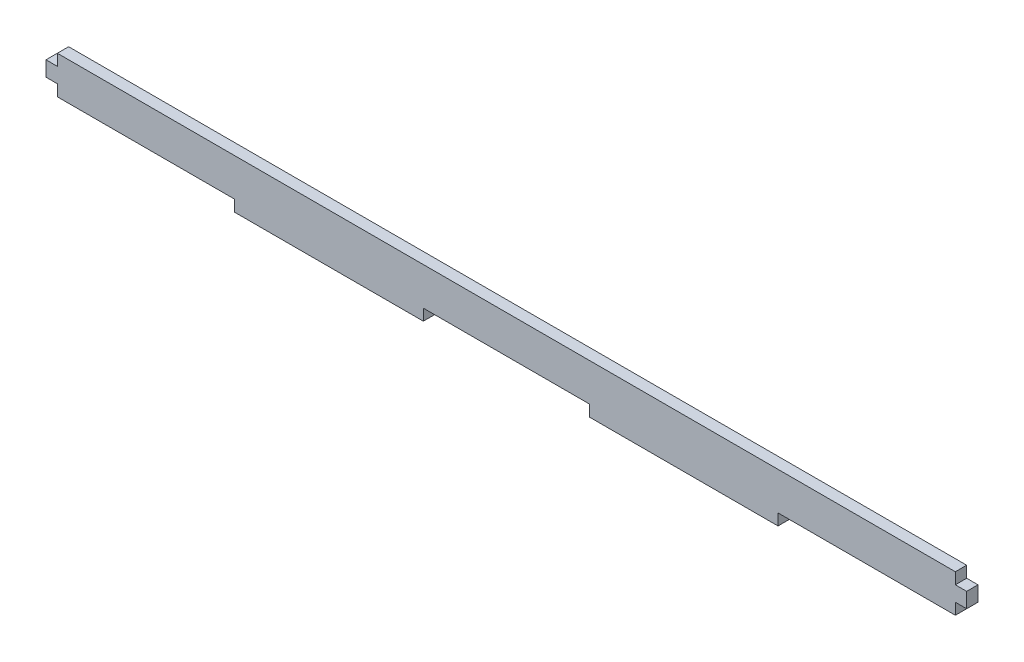
ISO-10303-21;
HEADER;
FILE_DESCRIPTION(('STEP AP214'),'2;1');
FILE_NAME('part.step','',(''),(''),'','','');
FILE_SCHEMA(('AUTOMOTIVE_DESIGN { 1 0 10303 214 1 1 1 1 }'));
ENDSEC;
DATA;
#1=APPLICATION_CONTEXT('core data for automotive mechanical design processes');
#2=APPLICATION_PROTOCOL_DEFINITION('international standard','automotive_design',2000,#1);
#3=PRODUCT_CONTEXT('',#1,'mechanical');
#4=PRODUCT('Part','Part','',(#3));
#5=PRODUCT_RELATED_PRODUCT_CATEGORY('part','',(#4));
#6=PRODUCT_DEFINITION_FORMATION('','',#4);
#7=PRODUCT_DEFINITION_CONTEXT('part definition',#1,'design');
#8=PRODUCT_DEFINITION('design','',#6,#7);
#9=PRODUCT_DEFINITION_SHAPE('','',#8);
#10=(LENGTH_UNIT() NAMED_UNIT(*) SI_UNIT(.MILLI.,.METRE.));
#11=(NAMED_UNIT(*) PLANE_ANGLE_UNIT() SI_UNIT($,.RADIAN.));
#12=(NAMED_UNIT(*) SI_UNIT($,.STERADIAN.) SOLID_ANGLE_UNIT());
#13=UNCERTAINTY_MEASURE_WITH_UNIT(LENGTH_MEASURE(1.E-05),#10,'distance_accuracy_value','');
#14=(GEOMETRIC_REPRESENTATION_CONTEXT(3) GLOBAL_UNCERTAINTY_ASSIGNED_CONTEXT((#13)) GLOBAL_UNIT_ASSIGNED_CONTEXT((#10,
#11,#12)) REPRESENTATION_CONTEXT('',''));
#15=CARTESIAN_POINT('',(0.,0.,0.));
#16=DIRECTION('',(0.,0.,1.));
#17=DIRECTION('',(1.,0.,0.));
#18=AXIS2_PLACEMENT_3D('',#15,#16,#17);
#19=CARTESIAN_POINT('',(0.,0.,3.));
#20=DIRECTION('',(1.,0.,0.));
#21=DIRECTION('',(0.,1.,0.));
#22=AXIS2_PLACEMENT_3D('',#19,#20,#21);
#23=PLANE('',#22);
#24=DIRECTION('',(0.,-1.,0.));
#25=VECTOR('',#24,1.);
#26=CARTESIAN_POINT('',(0.,0.,0.));
#27=LINE('',#26,#25);
#28=CARTESIAN_POINT('',(0.,3.,0.));
#29=VERTEX_POINT('',#28);
#30=CARTESIAN_POINT('',(0.,0.,0.));
#31=VERTEX_POINT('',#30);
#32=EDGE_CURVE('E200',#29,#31,#27,.T.);
#33=ORIENTED_EDGE('',*,*,#32,.T.);
#34=DIRECTION('',(0.,0.,-1.));
#35=VECTOR('',#34,1.);
#36=CARTESIAN_POINT('',(0.,0.,3.));
#37=LINE('',#36,#35);
#38=CARTESIAN_POINT('',(0.,0.,3.));
#39=VERTEX_POINT('',#38);
#40=EDGE_CURVE('E11',#39,#31,#37,.T.);
#41=ORIENTED_EDGE('',*,*,#40,.F.);
#42=DIRECTION('',(0.,-1.,0.));
#43=VECTOR('',#42,1.);
#44=CARTESIAN_POINT('',(0.,0.,3.));
#45=LINE('',#44,#43);
#46=CARTESIAN_POINT('',(0.,3.,3.));
#47=VERTEX_POINT('',#46);
#48=EDGE_CURVE('E238',#47,#39,#45,.T.);
#49=ORIENTED_EDGE('',*,*,#48,.F.);
#50=DIRECTION('',(0.,0.,-1.));
#51=VECTOR('',#50,1.);
#52=CARTESIAN_POINT('',(0.,3.,3.));
#53=LINE('',#52,#51);
#54=EDGE_CURVE('E196',#47,#29,#53,.T.);
#55=ORIENTED_EDGE('',*,*,#54,.T.);
#56=EDGE_LOOP('',(#33,#41,#49,#55));
#57=FACE_BOUND('',#56,.T.);
#58=ADVANCED_FACE('F32',(#57),#23,.F.);
#59=CARTESIAN_POINT('',(0.,0.,3.));
#60=DIRECTION('',(0.,1.,0.));
#61=DIRECTION('',(0.,0.,1.));
#62=AXIS2_PLACEMENT_3D('',#59,#60,#61);
#63=PLANE('',#62);
#64=DIRECTION('',(1.,0.,0.));
#65=VECTOR('',#64,1.);
#66=CARTESIAN_POINT('',(0.,0.,0.));
#67=LINE('',#66,#65);
#68=CARTESIAN_POINT('',(47.,0.,0.));
#69=VERTEX_POINT('',#68);
#70=EDGE_CURVE('E203',#31,#69,#67,.T.);
#71=ORIENTED_EDGE('',*,*,#70,.T.);
#72=DIRECTION('',(0.,0.,-1.));
#73=VECTOR('',#72,1.);
#74=CARTESIAN_POINT('',(47.,0.,3.));
#75=LINE('',#74,#73);
#76=CARTESIAN_POINT('',(47.,0.,3.));
#77=VERTEX_POINT('',#76);
#78=EDGE_CURVE('E40',#77,#69,#75,.T.);
#79=ORIENTED_EDGE('',*,*,#78,.F.);
#80=DIRECTION('',(1.,0.,0.));
#81=VECTOR('',#80,1.);
#82=CARTESIAN_POINT('',(0.,0.,3.));
#83=LINE('',#82,#81);
#84=EDGE_CURVE('E127',#39,#77,#83,.T.);
#85=ORIENTED_EDGE('',*,*,#84,.F.);
#86=ORIENTED_EDGE('',*,*,#40,.T.);
#87=EDGE_LOOP('',(#71,#79,#85,#86));
#88=FACE_BOUND('',#87,.T.);
#89=ADVANCED_FACE('F356',(#88),#63,.F.);
#90=CARTESIAN_POINT('',(47.,0.,3.));
#91=DIRECTION('',(1.,0.,0.));
#92=DIRECTION('',(0.,0.,-1.));
#93=AXIS2_PLACEMENT_3D('',#90,#91,#92);
#94=PLANE('',#93);
#95=DIRECTION('',(0.,-1.,0.));
#96=VECTOR('',#95,1.);
#97=CARTESIAN_POINT('',(47.,0.,0.));
#98=LINE('',#97,#96);
#99=CARTESIAN_POINT('',(47.,-3.,0.));
#100=VERTEX_POINT('',#99);
#101=EDGE_CURVE('E205',#69,#100,#98,.T.);
#102=ORIENTED_EDGE('',*,*,#101,.T.);
#103=DIRECTION('',(0.,0.,-1.));
#104=VECTOR('',#103,1.);
#105=CARTESIAN_POINT('',(47.,-3.,3.));
#106=LINE('',#105,#104);
#107=CARTESIAN_POINT('',(47.,-3.,3.));
#108=VERTEX_POINT('',#107);
#109=EDGE_CURVE('E281',#108,#100,#106,.T.);
#110=ORIENTED_EDGE('',*,*,#109,.F.);
#111=DIRECTION('',(0.,-1.,0.));
#112=VECTOR('',#111,1.);
#113=CARTESIAN_POINT('',(47.,0.,3.));
#114=LINE('',#113,#112);
#115=EDGE_CURVE('E289',#77,#108,#114,.T.);
#116=ORIENTED_EDGE('',*,*,#115,.F.);
#117=ORIENTED_EDGE('',*,*,#78,.T.);
#118=EDGE_LOOP('',(#102,#110,#116,#117));
#119=FACE_BOUND('',#118,.T.);
#120=ADVANCED_FACE('F287',(#119),#94,.F.);
#121=CARTESIAN_POINT('',(47.,-3.,3.));
#122=DIRECTION('',(0.,1.,0.));
#123=DIRECTION('',(-1.,0.,0.));
#124=AXIS2_PLACEMENT_3D('',#121,#122,#123);
#125=PLANE('',#124);
#126=DIRECTION('',(1.,0.,0.));
#127=VECTOR('',#126,1.);
#128=CARTESIAN_POINT('',(47.,-3.,0.));
#129=LINE('',#128,#127);
#130=CARTESIAN_POINT('',(97.,-3.,0.));
#131=VERTEX_POINT('',#130);
#132=EDGE_CURVE('E207',#100,#131,#129,.T.);
#133=ORIENTED_EDGE('',*,*,#132,.T.);
#134=DIRECTION('',(0.,0.,-1.));
#135=VECTOR('',#134,1.);
#136=CARTESIAN_POINT('',(97.,-3.,3.));
#137=LINE('',#136,#135);
#138=CARTESIAN_POINT('',(97.,-3.,3.));
#139=VERTEX_POINT('',#138);
#140=EDGE_CURVE('E278',#139,#131,#137,.T.);
#141=ORIENTED_EDGE('',*,*,#140,.F.);
#142=DIRECTION('',(1.,0.,0.));
#143=VECTOR('',#142,1.);
#144=CARTESIAN_POINT('',(47.,-3.,3.));
#145=LINE('',#144,#143);
#146=EDGE_CURVE('E307',#108,#139,#145,.T.);
#147=ORIENTED_EDGE('',*,*,#146,.F.);
#148=ORIENTED_EDGE('',*,*,#109,.T.);
#149=EDGE_LOOP('',(#133,#141,#147,#148));
#150=FACE_BOUND('',#149,.T.);
#151=ADVANCED_FACE('F298',(#150),#125,.F.);
#152=CARTESIAN_POINT('',(97.,0.,3.));
#153=DIRECTION('',(-1.,0.,0.));
#154=DIRECTION('',(0.,0.,1.));
#155=AXIS2_PLACEMENT_3D('',#152,#153,#154);
#156=PLANE('',#155);
#157=DIRECTION('',(0.,1.,0.));
#158=VECTOR('',#157,1.);
#159=CARTESIAN_POINT('',(97.,0.,0.));
#160=LINE('',#159,#158);
#161=CARTESIAN_POINT('',(97.,0.,0.));
#162=VERTEX_POINT('',#161);
#163=EDGE_CURVE('E209',#131,#162,#160,.T.);
#164=ORIENTED_EDGE('',*,*,#163,.T.);
#165=DIRECTION('',(0.,0.,-1.));
#166=VECTOR('',#165,1.);
#167=CARTESIAN_POINT('',(97.,0.,3.));
#168=LINE('',#167,#166);
#169=CARTESIAN_POINT('',(97.,0.,3.));
#170=VERTEX_POINT('',#169);
#171=EDGE_CURVE('E275',#170,#162,#168,.T.);
#172=ORIENTED_EDGE('',*,*,#171,.F.);
#173=DIRECTION('',(0.,1.,0.));
#174=VECTOR('',#173,1.);
#175=CARTESIAN_POINT('',(97.,0.,3.));
#176=LINE('',#175,#174);
#177=EDGE_CURVE('E304',#139,#170,#176,.T.);
#178=ORIENTED_EDGE('',*,*,#177,.F.);
#179=ORIENTED_EDGE('',*,*,#140,.T.);
#180=EDGE_LOOP('',(#164,#172,#178,#179));
#181=FACE_BOUND('',#180,.T.);
#182=ADVANCED_FACE('F302',(#181),#156,.F.);
#183=CARTESIAN_POINT('',(97.,0.,3.));
#184=DIRECTION('',(0.,1.,0.));
#185=DIRECTION('',(-1.,0.,0.));
#186=AXIS2_PLACEMENT_3D('',#183,#184,#185);
#187=PLANE('',#186);
#188=DIRECTION('',(1.,0.,0.));
#189=VECTOR('',#188,1.);
#190=CARTESIAN_POINT('',(97.,0.,0.));
#191=LINE('',#190,#189);
#192=CARTESIAN_POINT('',(141.,0.,0.));
#193=VERTEX_POINT('',#192);
#194=EDGE_CURVE('E211',#162,#193,#191,.T.);
#195=ORIENTED_EDGE('',*,*,#194,.T.);
#196=DIRECTION('',(0.,0.,-1.));
#197=VECTOR('',#196,1.);
#198=CARTESIAN_POINT('',(141.,0.,3.));
#199=LINE('',#198,#197);
#200=CARTESIAN_POINT('',(141.,0.,3.));
#201=VERTEX_POINT('',#200);
#202=EDGE_CURVE('E272',#201,#193,#199,.T.);
#203=ORIENTED_EDGE('',*,*,#202,.F.);
#204=DIRECTION('',(1.,0.,0.));
#205=VECTOR('',#204,1.);
#206=CARTESIAN_POINT('',(97.,0.,3.));
#207=LINE('',#206,#205);
#208=EDGE_CURVE('E306',#170,#201,#207,.T.);
#209=ORIENTED_EDGE('',*,*,#208,.F.);
#210=ORIENTED_EDGE('',*,*,#171,.T.);
#211=EDGE_LOOP('',(#195,#203,#209,#210));
#212=FACE_BOUND('',#211,.T.);
#213=ADVANCED_FACE('F369',(#212),#187,.F.);
#214=CARTESIAN_POINT('',(141.,0.,3.));
#215=DIRECTION('',(1.,0.,0.));
#216=DIRECTION('',(0.,0.,-1.));
#217=AXIS2_PLACEMENT_3D('',#214,#215,#216);
#218=PLANE('',#217);
#219=DIRECTION('',(0.,-1.,0.));
#220=VECTOR('',#219,1.);
#221=CARTESIAN_POINT('',(141.,0.,0.));
#222=LINE('',#221,#220);
#223=CARTESIAN_POINT('',(141.,-3.,0.));
#224=VERTEX_POINT('',#223);
#225=EDGE_CURVE('E213',#193,#224,#222,.T.);
#226=ORIENTED_EDGE('',*,*,#225,.T.);
#227=DIRECTION('',(0.,0.,-1.));
#228=VECTOR('',#227,1.);
#229=CARTESIAN_POINT('',(141.,-3.,3.));
#230=LINE('',#229,#228);
#231=CARTESIAN_POINT('',(141.,-3.,3.));
#232=VERTEX_POINT('',#231);
#233=EDGE_CURVE('E269',#232,#224,#230,.T.);
#234=ORIENTED_EDGE('',*,*,#233,.F.);
#235=DIRECTION('',(0.,-1.,0.));
#236=VECTOR('',#235,1.);
#237=CARTESIAN_POINT('',(141.,0.,3.));
#238=LINE('',#237,#236);
#239=EDGE_CURVE('E309',#201,#232,#238,.T.);
#240=ORIENTED_EDGE('',*,*,#239,.F.);
#241=ORIENTED_EDGE('',*,*,#202,.T.);
#242=EDGE_LOOP('',(#226,#234,#240,#241));
#243=FACE_BOUND('',#242,.T.);
#244=ADVANCED_FACE('F372',(#243),#218,.F.);
#245=CARTESIAN_POINT('',(141.,-3.,3.));
#246=DIRECTION('',(0.,1.,0.));
#247=DIRECTION('',(0.,0.,1.));
#248=AXIS2_PLACEMENT_3D('',#245,#246,#247);
#249=PLANE('',#248);
#250=DIRECTION('',(1.,0.,0.));
#251=VECTOR('',#250,1.);
#252=CARTESIAN_POINT('',(141.,-3.,0.));
#253=LINE('',#252,#251);
#254=CARTESIAN_POINT('',(191.,-3.,0.));
#255=VERTEX_POINT('',#254);
#256=EDGE_CURVE('E215',#224,#255,#253,.T.);
#257=ORIENTED_EDGE('',*,*,#256,.T.);
#258=DIRECTION('',(0.,0.,-1.));
#259=VECTOR('',#258,1.);
#260=CARTESIAN_POINT('',(191.,-3.,3.));
#261=LINE('',#260,#259);
#262=CARTESIAN_POINT('',(191.,-3.,3.));
#263=VERTEX_POINT('',#262);
#264=EDGE_CURVE('E266',#263,#255,#261,.T.);
#265=ORIENTED_EDGE('',*,*,#264,.F.);
#266=DIRECTION('',(1.,0.,0.));
#267=VECTOR('',#266,1.);
#268=CARTESIAN_POINT('',(141.,-3.,3.));
#269=LINE('',#268,#267);
#270=EDGE_CURVE('E315',#232,#263,#269,.T.);
#271=ORIENTED_EDGE('',*,*,#270,.F.);
#272=ORIENTED_EDGE('',*,*,#233,.T.);
#273=EDGE_LOOP('',(#257,#265,#271,#272));
#274=FACE_BOUND('',#273,.T.);
#275=ADVANCED_FACE('F376',(#274),#249,.F.);
#276=CARTESIAN_POINT('',(191.,0.,3.));
#277=DIRECTION('',(-1.,0.,0.));
#278=DIRECTION('',(0.,0.,1.));
#279=AXIS2_PLACEMENT_3D('',#276,#277,#278);
#280=PLANE('',#279);
#281=DIRECTION('',(0.,1.,0.));
#282=VECTOR('',#281,1.);
#283=CARTESIAN_POINT('',(191.,0.,0.));
#284=LINE('',#283,#282);
#285=CARTESIAN_POINT('',(191.,0.,0.));
#286=VERTEX_POINT('',#285);
#287=EDGE_CURVE('E217',#255,#286,#284,.T.);
#288=ORIENTED_EDGE('',*,*,#287,.T.);
#289=DIRECTION('',(0.,0.,-1.));
#290=VECTOR('',#289,1.);
#291=CARTESIAN_POINT('',(191.,0.,3.));
#292=LINE('',#291,#290);
#293=CARTESIAN_POINT('',(191.,0.,3.));
#294=VERTEX_POINT('',#293);
#295=EDGE_CURVE('E263',#294,#286,#292,.T.);
#296=ORIENTED_EDGE('',*,*,#295,.F.);
#297=DIRECTION('',(0.,1.,0.));
#298=VECTOR('',#297,1.);
#299=CARTESIAN_POINT('',(191.,0.,3.));
#300=LINE('',#299,#298);
#301=EDGE_CURVE('E317',#263,#294,#300,.T.);
#302=ORIENTED_EDGE('',*,*,#301,.F.);
#303=ORIENTED_EDGE('',*,*,#264,.T.);
#304=EDGE_LOOP('',(#288,#296,#302,#303));
#305=FACE_BOUND('',#304,.T.);
#306=ADVANCED_FACE('F380',(#305),#280,.F.);
#307=CARTESIAN_POINT('',(191.,0.,3.));
#308=DIRECTION('',(0.,1.,0.));
#309=DIRECTION('',(0.,0.,1.));
#310=AXIS2_PLACEMENT_3D('',#307,#308,#309);
#311=PLANE('',#310);
#312=DIRECTION('',(1.,0.,0.));
#313=VECTOR('',#312,1.);
#314=CARTESIAN_POINT('',(191.,0.,0.));
#315=LINE('',#314,#313);
#316=CARTESIAN_POINT('',(238.,0.,0.));
#317=VERTEX_POINT('',#316);
#318=EDGE_CURVE('E219',#286,#317,#315,.T.);
#319=ORIENTED_EDGE('',*,*,#318,.T.);
#320=DIRECTION('',(0.,0.,-1.));
#321=VECTOR('',#320,1.);
#322=CARTESIAN_POINT('',(238.,0.,3.));
#323=LINE('',#322,#321);
#324=CARTESIAN_POINT('',(238.,0.,3.));
#325=VERTEX_POINT('',#324);
#326=EDGE_CURVE('E260',#325,#317,#323,.T.);
#327=ORIENTED_EDGE('',*,*,#326,.F.);
#328=DIRECTION('',(1.,0.,0.));
#329=VECTOR('',#328,1.);
#330=CARTESIAN_POINT('',(191.,0.,3.));
#331=LINE('',#330,#329);
#332=EDGE_CURVE('E319',#294,#325,#331,.T.);
#333=ORIENTED_EDGE('',*,*,#332,.F.);
#334=ORIENTED_EDGE('',*,*,#295,.T.);
#335=EDGE_LOOP('',(#319,#327,#333,#334));
#336=FACE_BOUND('',#335,.T.);
#337=ADVANCED_FACE('F384',(#336),#311,.F.);
#338=CARTESIAN_POINT('',(238.,0.,3.));
#339=DIRECTION('',(-1.,0.,0.));
#340=DIRECTION('',(0.,0.,1.));
#341=AXIS2_PLACEMENT_3D('',#338,#339,#340);
#342=PLANE('',#341);
#343=DIRECTION('',(0.,1.,0.));
#344=VECTOR('',#343,1.);
#345=CARTESIAN_POINT('',(238.,0.,0.));
#346=LINE('',#345,#344);
#347=CARTESIAN_POINT('',(238.,3.,0.));
#348=VERTEX_POINT('',#347);
#349=EDGE_CURVE('E221',#317,#348,#346,.T.);
#350=ORIENTED_EDGE('',*,*,#349,.T.);
#351=DIRECTION('',(0.,0.,-1.));
#352=VECTOR('',#351,1.);
#353=CARTESIAN_POINT('',(238.,3.,3.));
#354=LINE('',#353,#352);
#355=CARTESIAN_POINT('',(238.,3.,3.));
#356=VERTEX_POINT('',#355);
#357=EDGE_CURVE('E257',#356,#348,#354,.T.);
#358=ORIENTED_EDGE('',*,*,#357,.F.);
#359=DIRECTION('',(0.,1.,0.));
#360=VECTOR('',#359,1.);
#361=CARTESIAN_POINT('',(238.,0.,3.));
#362=LINE('',#361,#360);
#363=EDGE_CURVE('E321',#325,#356,#362,.T.);
#364=ORIENTED_EDGE('',*,*,#363,.F.);
#365=ORIENTED_EDGE('',*,*,#326,.T.);
#366=EDGE_LOOP('',(#350,#358,#364,#365));
#367=FACE_BOUND('',#366,.T.);
#368=ADVANCED_FACE('F388',(#367),#342,.F.);
#369=CARTESIAN_POINT('',(238.,3.,3.));
#370=DIRECTION('',(0.,1.,0.));
#371=DIRECTION('',(-1.,0.,0.));
#372=AXIS2_PLACEMENT_3D('',#369,#370,#371);
#373=PLANE('',#372);
#374=DIRECTION('',(1.,0.,0.));
#375=VECTOR('',#374,1.);
#376=CARTESIAN_POINT('',(238.,3.,0.));
#377=LINE('',#376,#375);
#378=CARTESIAN_POINT('',(241.,3.,0.));
#379=VERTEX_POINT('',#378);
#380=EDGE_CURVE('E223',#348,#379,#377,.T.);
#381=ORIENTED_EDGE('',*,*,#380,.T.);
#382=DIRECTION('',(0.,0.,-1.));
#383=VECTOR('',#382,1.);
#384=CARTESIAN_POINT('',(241.,3.,3.));
#385=LINE('',#384,#383);
#386=CARTESIAN_POINT('',(241.,3.,3.));
#387=VERTEX_POINT('',#386);
#388=EDGE_CURVE('E254',#387,#379,#385,.T.);
#389=ORIENTED_EDGE('',*,*,#388,.F.);
#390=DIRECTION('',(1.,0.,0.));
#391=VECTOR('',#390,1.);
#392=CARTESIAN_POINT('',(238.,3.,3.));
#393=LINE('',#392,#391);
#394=EDGE_CURVE('E323',#356,#387,#393,.T.);
#395=ORIENTED_EDGE('',*,*,#394,.F.);
#396=ORIENTED_EDGE('',*,*,#357,.T.);
#397=EDGE_LOOP('',(#381,#389,#395,#396));
#398=FACE_BOUND('',#397,.T.);
#399=ADVANCED_FACE('F392',(#398),#373,.F.);
#400=CARTESIAN_POINT('',(241.,7.,3.));
#401=DIRECTION('',(-1.,0.,0.));
#402=DIRECTION('',(0.,0.,1.));
#403=AXIS2_PLACEMENT_3D('',#400,#401,#402);
#404=PLANE('',#403);
#405=DIRECTION('',(0.,1.,0.));
#406=VECTOR('',#405,1.);
#407=CARTESIAN_POINT('',(241.,7.,0.));
#408=LINE('',#407,#406);
#409=CARTESIAN_POINT('',(241.,7.,0.));
#410=VERTEX_POINT('',#409);
#411=EDGE_CURVE('E225',#379,#410,#408,.T.);
#412=ORIENTED_EDGE('',*,*,#411,.T.);
#413=DIRECTION('',(0.,0.,-1.));
#414=VECTOR('',#413,1.);
#415=CARTESIAN_POINT('',(241.,7.,3.));
#416=LINE('',#415,#414);
#417=CARTESIAN_POINT('',(241.,7.,3.));
#418=VERTEX_POINT('',#417);
#419=EDGE_CURVE('E251',#418,#410,#416,.T.);
#420=ORIENTED_EDGE('',*,*,#419,.F.);
#421=DIRECTION('',(0.,1.,0.));
#422=VECTOR('',#421,1.);
#423=CARTESIAN_POINT('',(241.,7.,3.));
#424=LINE('',#423,#422);
#425=EDGE_CURVE('E325',#387,#418,#424,.T.);
#426=ORIENTED_EDGE('',*,*,#425,.F.);
#427=ORIENTED_EDGE('',*,*,#388,.T.);
#428=EDGE_LOOP('',(#412,#420,#426,#427));
#429=FACE_BOUND('',#428,.T.);
#430=ADVANCED_FACE('F396',(#429),#404,.F.);
#431=CARTESIAN_POINT('',(238.,7.,3.));
#432=DIRECTION('',(0.,-1.,0.));
#433=DIRECTION('',(0.,0.,-1.));
#434=AXIS2_PLACEMENT_3D('',#431,#432,#433);
#435=PLANE('',#434);
#436=DIRECTION('',(-1.,0.,0.));
#437=VECTOR('',#436,1.);
#438=CARTESIAN_POINT('',(238.,7.,0.));
#439=LINE('',#438,#437);
#440=CARTESIAN_POINT('',(238.,7.,0.));
#441=VERTEX_POINT('',#440);
#442=EDGE_CURVE('E227',#410,#441,#439,.T.);
#443=ORIENTED_EDGE('',*,*,#442,.T.);
#444=DIRECTION('',(0.,0.,-1.));
#445=VECTOR('',#444,1.);
#446=CARTESIAN_POINT('',(238.,7.,3.));
#447=LINE('',#446,#445);
#448=CARTESIAN_POINT('',(238.,7.,3.));
#449=VERTEX_POINT('',#448);
#450=EDGE_CURVE('E248',#449,#441,#447,.T.);
#451=ORIENTED_EDGE('',*,*,#450,.F.);
#452=DIRECTION('',(-1.,0.,0.));
#453=VECTOR('',#452,1.);
#454=CARTESIAN_POINT('',(238.,7.,3.));
#455=LINE('',#454,#453);
#456=EDGE_CURVE('E327',#418,#449,#455,.T.);
#457=ORIENTED_EDGE('',*,*,#456,.F.);
#458=ORIENTED_EDGE('',*,*,#419,.T.);
#459=EDGE_LOOP('',(#443,#451,#457,#458));
#460=FACE_BOUND('',#459,.T.);
#461=ADVANCED_FACE('F400',(#460),#435,.F.);
#462=CARTESIAN_POINT('',(238.,7.,3.));
#463=DIRECTION('',(-1.,0.,0.));
#464=DIRECTION('',(0.,0.,1.));
#465=AXIS2_PLACEMENT_3D('',#462,#463,#464);
#466=PLANE('',#465);
#467=DIRECTION('',(0.,1.,0.));
#468=VECTOR('',#467,1.);
#469=CARTESIAN_POINT('',(238.,7.,0.));
#470=LINE('',#469,#468);
#471=CARTESIAN_POINT('',(238.,10.,0.));
#472=VERTEX_POINT('',#471);
#473=EDGE_CURVE('E229',#441,#472,#470,.T.);
#474=ORIENTED_EDGE('',*,*,#473,.T.);
#475=DIRECTION('',(0.,0.,-1.));
#476=VECTOR('',#475,1.);
#477=CARTESIAN_POINT('',(238.,10.,3.));
#478=LINE('',#477,#476);
#479=CARTESIAN_POINT('',(238.,10.,3.));
#480=VERTEX_POINT('',#479);
#481=EDGE_CURVE('E245',#480,#472,#478,.T.);
#482=ORIENTED_EDGE('',*,*,#481,.F.);
#483=DIRECTION('',(0.,1.,0.));
#484=VECTOR('',#483,1.);
#485=CARTESIAN_POINT('',(238.,7.,3.));
#486=LINE('',#485,#484);
#487=EDGE_CURVE('E329',#449,#480,#486,.T.);
#488=ORIENTED_EDGE('',*,*,#487,.F.);
#489=ORIENTED_EDGE('',*,*,#450,.T.);
#490=EDGE_LOOP('',(#474,#482,#488,#489));
#491=FACE_BOUND('',#490,.T.);
#492=ADVANCED_FACE('F404',(#491),#466,.F.);
#493=CARTESIAN_POINT('',(0.,10.,3.));
#494=DIRECTION('',(0.,-1.,0.));
#495=DIRECTION('',(0.,0.,-1.));
#496=AXIS2_PLACEMENT_3D('',#493,#494,#495);
#497=PLANE('',#496);
#498=DIRECTION('',(-1.,0.,0.));
#499=VECTOR('',#498,1.);
#500=CARTESIAN_POINT('',(0.,10.,0.));
#501=LINE('',#500,#499);
#502=CARTESIAN_POINT('',(0.,10.,0.));
#503=VERTEX_POINT('',#502);
#504=EDGE_CURVE('E231',#472,#503,#501,.T.);
#505=ORIENTED_EDGE('',*,*,#504,.T.);
#506=DIRECTION('',(0.,0.,-1.));
#507=VECTOR('',#506,1.);
#508=CARTESIAN_POINT('',(0.,10.,3.));
#509=LINE('',#508,#507);
#510=CARTESIAN_POINT('',(0.,10.,3.));
#511=VERTEX_POINT('',#510);
#512=EDGE_CURVE('E242',#511,#503,#509,.T.);
#513=ORIENTED_EDGE('',*,*,#512,.F.);
#514=DIRECTION('',(-1.,0.,0.));
#515=VECTOR('',#514,1.);
#516=CARTESIAN_POINT('',(0.,10.,3.));
#517=LINE('',#516,#515);
#518=EDGE_CURVE('E331',#480,#511,#517,.T.);
#519=ORIENTED_EDGE('',*,*,#518,.F.);
#520=ORIENTED_EDGE('',*,*,#481,.T.);
#521=EDGE_LOOP('',(#505,#513,#519,#520));
#522=FACE_BOUND('',#521,.T.);
#523=ADVANCED_FACE('F337',(#522),#497,.F.);
#524=CARTESIAN_POINT('',(0.,7.,3.));
#525=DIRECTION('',(1.,0.,0.));
#526=DIRECTION('',(0.,1.,0.));
#527=AXIS2_PLACEMENT_3D('',#524,#525,#526);
#528=PLANE('',#527);
#529=DIRECTION('',(0.,-1.,0.));
#530=VECTOR('',#529,1.);
#531=CARTESIAN_POINT('',(0.,7.,0.));
#532=LINE('',#531,#530);
#533=CARTESIAN_POINT('',(0.,7.,0.));
#534=VERTEX_POINT('',#533);
#535=EDGE_CURVE('E233',#503,#534,#532,.T.);
#536=ORIENTED_EDGE('',*,*,#535,.T.);
#537=DIRECTION('',(0.,0.,-1.));
#538=VECTOR('',#537,1.);
#539=CARTESIAN_POINT('',(0.,7.,3.));
#540=LINE('',#539,#538);
#541=CARTESIAN_POINT('',(0.,7.,3.));
#542=VERTEX_POINT('',#541);
#543=EDGE_CURVE('E191',#542,#534,#540,.T.);
#544=ORIENTED_EDGE('',*,*,#543,.F.);
#545=DIRECTION('',(0.,-1.,0.));
#546=VECTOR('',#545,1.);
#547=CARTESIAN_POINT('',(0.,7.,3.));
#548=LINE('',#547,#546);
#549=EDGE_CURVE('E182',#511,#542,#548,.T.);
#550=ORIENTED_EDGE('',*,*,#549,.F.);
#551=ORIENTED_EDGE('',*,*,#512,.T.);
#552=EDGE_LOOP('',(#536,#544,#550,#551));
#553=FACE_BOUND('',#552,.T.);
#554=ADVANCED_FACE('F341',(#553),#528,.F.);
#555=CARTESIAN_POINT('',(0.,7.,3.));
#556=DIRECTION('',(0.,-1.,0.));
#557=DIRECTION('',(0.,0.,-1.));
#558=AXIS2_PLACEMENT_3D('',#555,#556,#557);
#559=PLANE('',#558);
#560=DIRECTION('',(-1.,0.,0.));
#561=VECTOR('',#560,1.);
#562=CARTESIAN_POINT('',(0.,7.,0.));
#563=LINE('',#562,#561);
#564=CARTESIAN_POINT('',(-3.,7.,0.));
#565=VERTEX_POINT('',#564);
#566=EDGE_CURVE('E190',#534,#565,#563,.T.);
#567=ORIENTED_EDGE('',*,*,#566,.T.);
#568=DIRECTION('',(0.,0.,-1.));
#569=VECTOR('',#568,1.);
#570=CARTESIAN_POINT('',(-3.,7.,3.));
#571=LINE('',#570,#569);
#572=CARTESIAN_POINT('',(-3.,7.,3.));
#573=VERTEX_POINT('',#572);
#574=EDGE_CURVE('E187',#573,#565,#571,.T.);
#575=ORIENTED_EDGE('',*,*,#574,.F.);
#576=DIRECTION('',(-1.,0.,0.));
#577=VECTOR('',#576,1.);
#578=CARTESIAN_POINT('',(0.,7.,3.));
#579=LINE('',#578,#577);
#580=EDGE_CURVE('E176',#542,#573,#579,.T.);
#581=ORIENTED_EDGE('',*,*,#580,.F.);
#582=ORIENTED_EDGE('',*,*,#543,.T.);
#583=EDGE_LOOP('',(#567,#575,#581,#582));
#584=FACE_BOUND('',#583,.T.);
#585=ADVANCED_FACE('F188',(#584),#559,.F.);
#586=CARTESIAN_POINT('',(-3.,7.,3.));
#587=DIRECTION('',(1.,0.,0.));
#588=DIRECTION('',(0.,1.,0.));
#589=AXIS2_PLACEMENT_3D('',#586,#587,#588);
#590=PLANE('',#589);
#591=DIRECTION('',(0.,-1.,0.));
#592=VECTOR('',#591,1.);
#593=CARTESIAN_POINT('',(-3.,7.,0.));
#594=LINE('',#593,#592);
#595=CARTESIAN_POINT('',(-3.,3.,0.));
#596=VERTEX_POINT('',#595);
#597=EDGE_CURVE('E113',#565,#596,#594,.T.);
#598=ORIENTED_EDGE('',*,*,#597,.T.);
#599=DIRECTION('',(0.,0.,-1.));
#600=VECTOR('',#599,1.);
#601=CARTESIAN_POINT('',(-3.,3.,3.));
#602=LINE('',#601,#600);
#603=CARTESIAN_POINT('',(-3.,3.,3.));
#604=VERTEX_POINT('',#603);
#605=EDGE_CURVE('E192',#604,#596,#602,.T.);
#606=ORIENTED_EDGE('',*,*,#605,.F.);
#607=DIRECTION('',(0.,-1.,0.));
#608=VECTOR('',#607,1.);
#609=CARTESIAN_POINT('',(-3.,7.,3.));
#610=LINE('',#609,#608);
#611=EDGE_CURVE('E180',#573,#604,#610,.T.);
#612=ORIENTED_EDGE('',*,*,#611,.F.);
#613=ORIENTED_EDGE('',*,*,#574,.T.);
#614=EDGE_LOOP('',(#598,#606,#612,#613));
#615=FACE_BOUND('',#614,.T.);
#616=ADVANCED_FACE('F194',(#615),#590,.F.);
#617=CARTESIAN_POINT('',(0.,3.,3.));
#618=DIRECTION('',(0.,1.,0.));
#619=DIRECTION('',(-1.,0.,0.));
#620=AXIS2_PLACEMENT_3D('',#617,#618,#619);
#621=PLANE('',#620);
#622=DIRECTION('',(1.,0.,0.));
#623=VECTOR('',#622,1.);
#624=CARTESIAN_POINT('',(0.,3.,0.));
#625=LINE('',#624,#623);
#626=EDGE_CURVE('E119',#596,#29,#625,.T.);
#627=ORIENTED_EDGE('',*,*,#626,.T.);
#628=ORIENTED_EDGE('',*,*,#54,.F.);
#629=DIRECTION('',(1.,0.,0.));
#630=VECTOR('',#629,1.);
#631=CARTESIAN_POINT('',(0.,3.,3.));
#632=LINE('',#631,#630);
#633=EDGE_CURVE('E48',#604,#47,#632,.T.);
#634=ORIENTED_EDGE('',*,*,#633,.F.);
#635=ORIENTED_EDGE('',*,*,#605,.T.);
#636=EDGE_LOOP('',(#627,#628,#634,#635));
#637=FACE_BOUND('',#636,.T.);
#638=ADVANCED_FACE('F345',(#637),#621,.F.);
#639=CARTESIAN_POINT('',(0.,0.,3.));
#640=DIRECTION('',(0.,0.,1.));
#641=DIRECTION('',(1.,0.,0.));
#642=AXIS2_PLACEMENT_3D('',#639,#640,#641);
#643=PLANE('',#642);
#644=ORIENTED_EDGE('',*,*,#48,.T.);
#645=ORIENTED_EDGE('',*,*,#84,.T.);
#646=ORIENTED_EDGE('',*,*,#115,.T.);
#647=ORIENTED_EDGE('',*,*,#146,.T.);
#648=ORIENTED_EDGE('',*,*,#177,.T.);
#649=ORIENTED_EDGE('',*,*,#208,.T.);
#650=ORIENTED_EDGE('',*,*,#239,.T.);
#651=ORIENTED_EDGE('',*,*,#270,.T.);
#652=ORIENTED_EDGE('',*,*,#301,.T.);
#653=ORIENTED_EDGE('',*,*,#332,.T.);
#654=ORIENTED_EDGE('',*,*,#363,.T.);
#655=ORIENTED_EDGE('',*,*,#394,.T.);
#656=ORIENTED_EDGE('',*,*,#425,.T.);
#657=ORIENTED_EDGE('',*,*,#456,.T.);
#658=ORIENTED_EDGE('',*,*,#487,.T.);
#659=ORIENTED_EDGE('',*,*,#518,.T.);
#660=ORIENTED_EDGE('',*,*,#549,.T.);
#661=ORIENTED_EDGE('',*,*,#580,.T.);
#662=ORIENTED_EDGE('',*,*,#611,.T.);
#663=ORIENTED_EDGE('',*,*,#633,.T.);
#664=EDGE_LOOP('',(#644,#645,#646,#647,#648,#649,#650,#651,#652,#653,#654,#655,#656,#657,#658,
#659,#660,#661,#662,#663));
#665=FACE_BOUND('',#664,.T.);
#666=ADVANCED_FACE('F178',(#665),#643,.T.);
#667=CARTESIAN_POINT('',(0.,0.,0.));
#668=DIRECTION('',(0.,0.,1.));
#669=DIRECTION('',(1.,0.,0.));
#670=AXIS2_PLACEMENT_3D('',#667,#668,#669);
#671=PLANE('',#670);
#672=ORIENTED_EDGE('',*,*,#32,.F.);
#673=ORIENTED_EDGE('',*,*,#626,.F.);
#674=ORIENTED_EDGE('',*,*,#597,.F.);
#675=ORIENTED_EDGE('',*,*,#566,.F.);
#676=ORIENTED_EDGE('',*,*,#535,.F.);
#677=ORIENTED_EDGE('',*,*,#504,.F.);
#678=ORIENTED_EDGE('',*,*,#473,.F.);
#679=ORIENTED_EDGE('',*,*,#442,.F.);
#680=ORIENTED_EDGE('',*,*,#411,.F.);
#681=ORIENTED_EDGE('',*,*,#380,.F.);
#682=ORIENTED_EDGE('',*,*,#349,.F.);
#683=ORIENTED_EDGE('',*,*,#318,.F.);
#684=ORIENTED_EDGE('',*,*,#287,.F.);
#685=ORIENTED_EDGE('',*,*,#256,.F.);
#686=ORIENTED_EDGE('',*,*,#225,.F.);
#687=ORIENTED_EDGE('',*,*,#194,.F.);
#688=ORIENTED_EDGE('',*,*,#163,.F.);
#689=ORIENTED_EDGE('',*,*,#132,.F.);
#690=ORIENTED_EDGE('',*,*,#101,.F.);
#691=ORIENTED_EDGE('',*,*,#70,.F.);
#692=EDGE_LOOP('',(#672,#673,#674,#675,#676,#677,#678,#679,#680,#681,#682,#683,#684,#685,#686,
#687,#688,#689,#690,#691));
#693=FACE_BOUND('',#692,.T.);
#694=ADVANCED_FACE('F293',(#693),#671,.F.);
#695=CLOSED_SHELL('',(#58,#89,#120,#151,#182,#213,#244,#275,#306,#337,#368,#399,#430,#461,#492,
#523,#554,#585,#616,#638,#666,#694));
#696=MANIFOLD_SOLID_BREP('B2',#695);
#697=ADVANCED_BREP_SHAPE_REPRESENTATION('',(#18,#696),#14);
#698=SHAPE_DEFINITION_REPRESENTATION(#9,#697);
ENDSEC;
END-ISO-10303-21;
